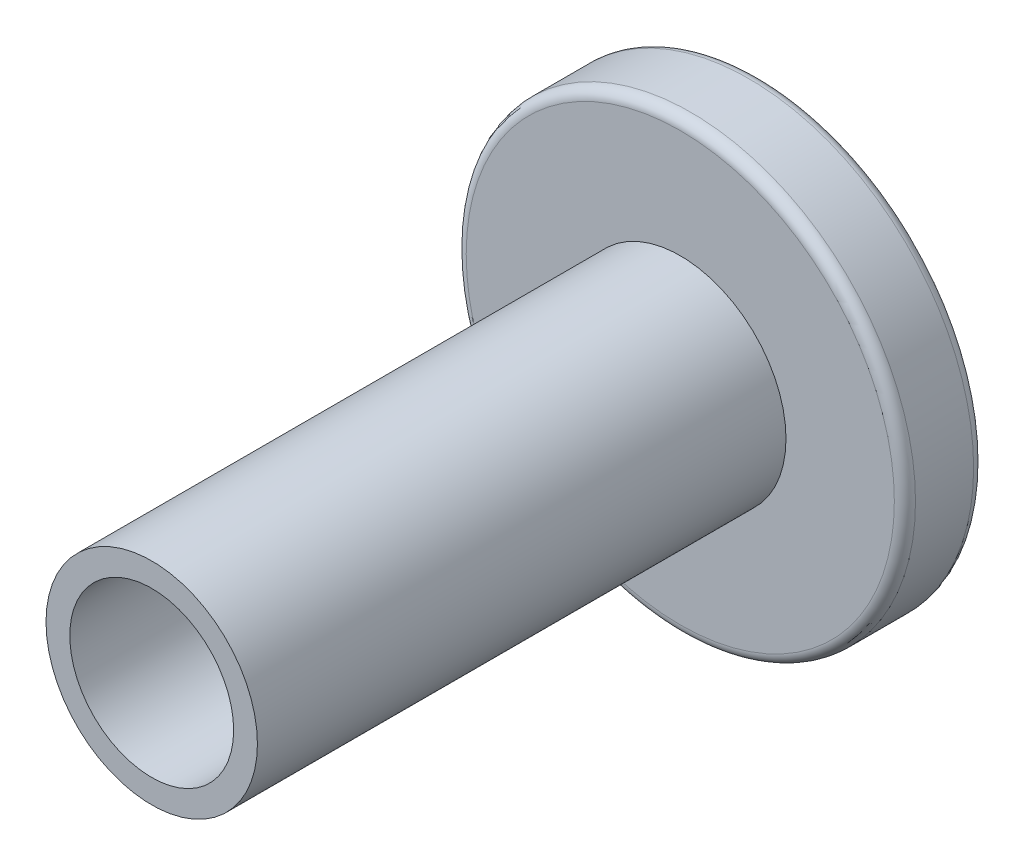
ISO-10303-21;
HEADER;
FILE_DESCRIPTION(('STEP AP214'),'2;1');
FILE_NAME('part.step','',(''),(''),'','','');
FILE_SCHEMA(('AUTOMOTIVE_DESIGN { 1 0 10303 214 1 1 1 1 }'));
ENDSEC;
DATA;
#1=APPLICATION_CONTEXT('core data for automotive mechanical design processes');
#2=APPLICATION_PROTOCOL_DEFINITION('international standard','automotive_design',2000,#1);
#3=PRODUCT_CONTEXT('',#1,'mechanical');
#4=PRODUCT('Part','Part','',(#3));
#5=PRODUCT_RELATED_PRODUCT_CATEGORY('part','',(#4));
#6=PRODUCT_DEFINITION_FORMATION('','',#4);
#7=PRODUCT_DEFINITION_CONTEXT('part definition',#1,'design');
#8=PRODUCT_DEFINITION('design','',#6,#7);
#9=PRODUCT_DEFINITION_SHAPE('','',#8);
#10=(LENGTH_UNIT() NAMED_UNIT(*) SI_UNIT(.MILLI.,.METRE.));
#11=(NAMED_UNIT(*) PLANE_ANGLE_UNIT() SI_UNIT($,.RADIAN.));
#12=(NAMED_UNIT(*) SI_UNIT($,.STERADIAN.) SOLID_ANGLE_UNIT());
#13=UNCERTAINTY_MEASURE_WITH_UNIT(LENGTH_MEASURE(1.E-05),#10,'distance_accuracy_value','');
#14=(GEOMETRIC_REPRESENTATION_CONTEXT(3) GLOBAL_UNCERTAINTY_ASSIGNED_CONTEXT((#13)) GLOBAL_UNIT_ASSIGNED_CONTEXT((#10,
#11,#12)) REPRESENTATION_CONTEXT('',''));
#15=CARTESIAN_POINT('',(0.,0.,0.));
#16=DIRECTION('',(0.,0.,1.));
#17=DIRECTION('',(1.,0.,0.));
#18=AXIS2_PLACEMENT_3D('',#15,#16,#17);
#19=CARTESIAN_POINT('',(0.,0.,1.5));
#20=DIRECTION('',(0.,0.,1.));
#21=DIRECTION('',(1.,0.,0.));
#22=AXIS2_PLACEMENT_3D('',#19,#20,#21);
#23=PLANE('',#22);
#24=CARTESIAN_POINT('',(0.,0.,1.5));
#25=DIRECTION('',(0.,0.,1.));
#26=DIRECTION('',(1.,0.,0.));
#27=AXIS2_PLACEMENT_3D('',#24,#25,#26);
#28=CIRCLE('',#27,1.55);
#29=CARTESIAN_POINT('',(1.55,0.,1.5));
#30=VERTEX_POINT('',#29);
#31=EDGE_CURVE('E148',#30,#30,#28,.F.);
#32=ORIENTED_EDGE('',*,*,#31,.F.);
#33=EDGE_LOOP('',(#32));
#34=FACE_BOUND('',#33,.T.);
#35=DIRECTION('',(-1.,0.,0.));
#36=VECTOR('',#35,1.);
#37=CARTESIAN_POINT('',(0.721687836487032,-1.25,1.5));
#38=LINE('',#37,#36);
#39=CARTESIAN_POINT('',(0.721687836487032,-1.25,1.5));
#40=VERTEX_POINT('',#39);
#41=CARTESIAN_POINT('',(-0.721687836487033,-1.25,1.5));
#42=VERTEX_POINT('',#41);
#43=EDGE_CURVE('E99',#40,#42,#38,.T.);
#44=ORIENTED_EDGE('',*,*,#43,.T.);
#45=DIRECTION('',(-0.5,0.866025403784438,0.));
#46=VECTOR('',#45,1.);
#47=CARTESIAN_POINT('',(-0.721687836487033,-1.25,1.5));
#48=LINE('',#47,#46);
#49=CARTESIAN_POINT('',(-1.44337567297407,0.,1.5));
#50=VERTEX_POINT('',#49);
#51=EDGE_CURVE('E93',#42,#50,#48,.T.);
#52=ORIENTED_EDGE('',*,*,#51,.T.);
#53=DIRECTION('',(0.5,0.866025403784438,0.));
#54=VECTOR('',#53,1.);
#55=CARTESIAN_POINT('',(-1.44337567297407,0.,1.5));
#56=LINE('',#55,#54);
#57=CARTESIAN_POINT('',(-0.721687836487032,1.25,1.5));
#58=VERTEX_POINT('',#57);
#59=EDGE_CURVE('E102',#50,#58,#56,.T.);
#60=ORIENTED_EDGE('',*,*,#59,.T.);
#61=DIRECTION('',(1.,0.,0.));
#62=VECTOR('',#61,1.);
#63=CARTESIAN_POINT('',(-0.721687836487032,1.25,1.5));
#64=LINE('',#63,#62);
#65=CARTESIAN_POINT('',(0.721687836487032,1.25,1.5));
#66=VERTEX_POINT('',#65);
#67=EDGE_CURVE('E53',#58,#66,#64,.T.);
#68=ORIENTED_EDGE('',*,*,#67,.T.);
#69=DIRECTION('',(0.5,-0.866025403784438,0.));
#70=VECTOR('',#69,1.);
#71=CARTESIAN_POINT('',(0.721687836487032,1.25,1.5));
#72=LINE('',#71,#70);
#73=CARTESIAN_POINT('',(1.44337567297406,0.,1.5));
#74=VERTEX_POINT('',#73);
#75=EDGE_CURVE('E115',#66,#74,#72,.T.);
#76=ORIENTED_EDGE('',*,*,#75,.T.);
#77=DIRECTION('',(-0.5,-0.866025403784438,0.));
#78=VECTOR('',#77,1.);
#79=CARTESIAN_POINT('',(1.44337567297406,0.,1.5));
#80=LINE('',#79,#78);
#81=EDGE_CURVE('E118',#74,#40,#80,.T.);
#82=ORIENTED_EDGE('',*,*,#81,.T.);
#83=EDGE_LOOP('',(#44,#52,#60,#68,#76,#82));
#84=FACE_BOUND('',#83,.T.);
#85=ADVANCED_FACE('F38',(#34,#84),#23,.T.);
#86=CARTESIAN_POINT('',(0.,0.,1.5));
#87=DIRECTION('',(0.,0.,-1.));
#88=DIRECTION('',(-1.,0.,0.));
#89=AXIS2_PLACEMENT_3D('',#86,#87,#88);
#90=CYLINDRICAL_SURFACE('',#89,4.25);
#91=CARTESIAN_POINT('',(0.,0.,0.2));
#92=DIRECTION('',(0.,0.,1.));
#93=DIRECTION('',(1.,0.,0.));
#94=AXIS2_PLACEMENT_3D('',#91,#92,#93);
#95=CIRCLE('',#94,4.25);
#96=CARTESIAN_POINT('',(4.25,0.,0.2));
#97=VERTEX_POINT('',#96);
#98=EDGE_CURVE('E156',#97,#97,#95,.T.);
#99=ORIENTED_EDGE('',*,*,#98,.T.);
#100=EDGE_LOOP('',(#99));
#101=FACE_BOUND('',#100,.T.);
#102=CARTESIAN_POINT('',(0.,0.,1.3));
#103=DIRECTION('',(0.,0.,1.));
#104=DIRECTION('',(1.,0.,0.));
#105=AXIS2_PLACEMENT_3D('',#102,#103,#104);
#106=CIRCLE('',#105,4.25);
#107=CARTESIAN_POINT('',(4.25,0.,1.3));
#108=VERTEX_POINT('',#107);
#109=EDGE_CURVE('E153',#108,#108,#106,.F.);
#110=ORIENTED_EDGE('',*,*,#109,.T.);
#111=EDGE_LOOP('',(#110));
#112=FACE_BOUND('',#111,.T.);
#113=ADVANCED_FACE('F169',(#101,#112),#90,.T.);
#114=CARTESIAN_POINT('',(0.,0.,1.5));
#115=DIRECTION('',(0.,0.,1.));
#116=DIRECTION('',(1.,0.,0.));
#117=AXIS2_PLACEMENT_3D('',#114,#115,#116);
#118=CIRCLE('',#117,4.05);
#119=CARTESIAN_POINT('',(4.05,0.,1.5));
#120=VERTEX_POINT('',#119);
#121=EDGE_CURVE('E11',#120,#120,#118,.T.);
#122=ORIENTED_EDGE('',*,*,#121,.T.);
#123=EDGE_LOOP('',(#122));
#124=FACE_BOUND('',#123,.T.);
#125=CARTESIAN_POINT('',(0.,0.,1.5));
#126=DIRECTION('',(0.,0.,1.));
#127=DIRECTION('',(1.,0.,0.));
#128=AXIS2_PLACEMENT_3D('',#125,#126,#127);
#129=CIRCLE('',#128,2.);
#130=CARTESIAN_POINT('',(2.,0.,1.5));
#131=VERTEX_POINT('',#130);
#132=EDGE_CURVE('E144',#131,#131,#129,.T.);
#133=ORIENTED_EDGE('',*,*,#132,.F.);
#134=EDGE_LOOP('',(#133));
#135=FACE_BOUND('',#134,.T.);
#136=ADVANCED_FACE('F172',(#124,#135),#23,.T.);
#137=CARTESIAN_POINT('',(0.,0.,0.));
#138=DIRECTION('',(0.,0.,1.));
#139=DIRECTION('',(1.,0.,0.));
#140=AXIS2_PLACEMENT_3D('',#137,#138,#139);
#141=PLANE('',#140);
#142=DIRECTION('',(0.5,0.866025403784438,0.));
#143=VECTOR('',#142,1.);
#144=CARTESIAN_POINT('',(-1.44337567297407,0.,0.));
#145=LINE('',#144,#143);
#146=CARTESIAN_POINT('',(-1.44337567297407,0.,0.));
#147=VERTEX_POINT('',#146);
#148=CARTESIAN_POINT('',(-0.721687836487032,1.25,0.));
#149=VERTEX_POINT('',#148);
#150=EDGE_CURVE('E122',#147,#149,#145,.T.);
#151=ORIENTED_EDGE('',*,*,#150,.F.);
#152=DIRECTION('',(-0.5,0.866025403784438,0.));
#153=VECTOR('',#152,1.);
#154=CARTESIAN_POINT('',(-0.721687836487033,-1.25,0.));
#155=LINE('',#154,#153);
#156=CARTESIAN_POINT('',(-0.721687836487033,-1.25,0.));
#157=VERTEX_POINT('',#156);
#158=EDGE_CURVE('E61',#157,#147,#155,.T.);
#159=ORIENTED_EDGE('',*,*,#158,.F.);
#160=DIRECTION('',(-1.,0.,0.));
#161=VECTOR('',#160,1.);
#162=CARTESIAN_POINT('',(0.721687836487032,-1.25,0.));
#163=LINE('',#162,#161);
#164=CARTESIAN_POINT('',(0.721687836487032,-1.25,0.));
#165=VERTEX_POINT('',#164);
#166=EDGE_CURVE('E108',#165,#157,#163,.T.);
#167=ORIENTED_EDGE('',*,*,#166,.F.);
#168=DIRECTION('',(-0.5,-0.866025403784438,0.));
#169=VECTOR('',#168,1.);
#170=CARTESIAN_POINT('',(1.44337567297406,0.,0.));
#171=LINE('',#170,#169);
#172=CARTESIAN_POINT('',(1.44337567297406,0.,0.));
#173=VERTEX_POINT('',#172);
#174=EDGE_CURVE('E111',#173,#165,#171,.T.);
#175=ORIENTED_EDGE('',*,*,#174,.F.);
#176=DIRECTION('',(0.5,-0.866025403784438,0.));
#177=VECTOR('',#176,1.);
#178=CARTESIAN_POINT('',(0.721687836487032,1.25,0.));
#179=LINE('',#178,#177);
#180=CARTESIAN_POINT('',(0.721687836487032,1.25,0.));
#181=VERTEX_POINT('',#180);
#182=EDGE_CURVE('E127',#181,#173,#179,.T.);
#183=ORIENTED_EDGE('',*,*,#182,.F.);
#184=DIRECTION('',(1.,0.,0.));
#185=VECTOR('',#184,1.);
#186=CARTESIAN_POINT('',(-0.721687836487032,1.25,0.));
#187=LINE('',#186,#185);
#188=EDGE_CURVE('E124',#149,#181,#187,.T.);
#189=ORIENTED_EDGE('',*,*,#188,.F.);
#190=EDGE_LOOP('',(#151,#159,#167,#175,#183,#189));
#191=FACE_BOUND('',#190,.T.);
#192=CARTESIAN_POINT('',(0.,0.,0.));
#193=DIRECTION('',(0.,0.,1.));
#194=DIRECTION('',(1.,0.,0.));
#195=AXIS2_PLACEMENT_3D('',#192,#193,#194);
#196=CIRCLE('',#195,4.05);
#197=CARTESIAN_POINT('',(4.05,0.,0.));
#198=VERTEX_POINT('',#197);
#199=EDGE_CURVE('E46',#198,#198,#196,.F.);
#200=ORIENTED_EDGE('',*,*,#199,.T.);
#201=EDGE_LOOP('',(#200));
#202=FACE_BOUND('',#201,.T.);
#203=ADVANCED_FACE('F161',(#191,#202),#141,.F.);
#204=CARTESIAN_POINT('',(0.,0.,11.5));
#205=DIRECTION('',(0.,0.,1.));
#206=DIRECTION('',(1.,0.,0.));
#207=AXIS2_PLACEMENT_3D('',#204,#205,#206);
#208=PLANE('',#207);
#209=CARTESIAN_POINT('',(0.,0.,11.5));
#210=DIRECTION('',(0.,0.,1.));
#211=DIRECTION('',(1.,0.,0.));
#212=AXIS2_PLACEMENT_3D('',#209,#210,#211);
#213=CIRCLE('',#212,2.);
#214=CARTESIAN_POINT('',(2.,0.,11.5));
#215=VERTEX_POINT('',#214);
#216=EDGE_CURVE('E145',#215,#215,#213,.T.);
#217=ORIENTED_EDGE('',*,*,#216,.T.);
#218=EDGE_LOOP('',(#217));
#219=FACE_BOUND('',#218,.T.);
#220=CARTESIAN_POINT('',(0.,0.,11.5));
#221=DIRECTION('',(0.,0.,1.));
#222=DIRECTION('',(1.,0.,0.));
#223=AXIS2_PLACEMENT_3D('',#220,#221,#222);
#224=CIRCLE('',#223,1.55);
#225=CARTESIAN_POINT('',(1.55,0.,11.5));
#226=VERTEX_POINT('',#225);
#227=EDGE_CURVE('E134',#226,#226,#224,.T.);
#228=ORIENTED_EDGE('',*,*,#227,.F.);
#229=EDGE_LOOP('',(#228));
#230=FACE_BOUND('',#229,.T.);
#231=ADVANCED_FACE('F187',(#219,#230),#208,.T.);
#232=CARTESIAN_POINT('',(0.,0.,11.5));
#233=DIRECTION('',(0.,0.,-1.));
#234=DIRECTION('',(-1.,0.,0.));
#235=AXIS2_PLACEMENT_3D('',#232,#233,#234);
#236=CYLINDRICAL_SURFACE('',#235,2.);
#237=ORIENTED_EDGE('',*,*,#216,.F.);
#238=EDGE_LOOP('',(#237));
#239=FACE_BOUND('',#238,.T.);
#240=ORIENTED_EDGE('',*,*,#132,.T.);
#241=EDGE_LOOP('',(#240));
#242=FACE_BOUND('',#241,.T.);
#243=ADVANCED_FACE('F185',(#239,#242),#236,.T.);
#244=CARTESIAN_POINT('',(0.,0.,11.5));
#245=DIRECTION('',(0.,0.,-1.));
#246=DIRECTION('',(-1.,0.,0.));
#247=AXIS2_PLACEMENT_3D('',#244,#245,#246);
#248=CYLINDRICAL_SURFACE('',#247,1.55);
#249=ORIENTED_EDGE('',*,*,#227,.T.);
#250=EDGE_LOOP('',(#249));
#251=FACE_BOUND('',#250,.T.);
#252=ORIENTED_EDGE('',*,*,#31,.T.);
#253=EDGE_LOOP('',(#252));
#254=FACE_BOUND('',#253,.T.);
#255=ADVANCED_FACE('F166',(#251,#254),#248,.F.);
#256=CARTESIAN_POINT('',(0.,0.,0.2));
#257=DIRECTION('',(0.,0.,1.));
#258=DIRECTION('',(1.,0.,0.));
#259=AXIS2_PLACEMENT_3D('',#256,#257,#258);
#260=TOROIDAL_SURFACE('',#259,4.05,0.2);
#261=ORIENTED_EDGE('',*,*,#199,.F.);
#262=EDGE_LOOP('',(#261));
#263=FACE_BOUND('',#262,.T.);
#264=ORIENTED_EDGE('',*,*,#98,.F.);
#265=EDGE_LOOP('',(#264));
#266=FACE_BOUND('',#265,.T.);
#267=ADVANCED_FACE('F163',(#263,#266),#260,.T.);
#268=CARTESIAN_POINT('',(0.,0.,1.3));
#269=DIRECTION('',(0.,0.,1.));
#270=DIRECTION('',(1.,0.,0.));
#271=AXIS2_PLACEMENT_3D('',#268,#269,#270);
#272=TOROIDAL_SURFACE('',#271,4.05,0.2);
#273=ORIENTED_EDGE('',*,*,#109,.F.);
#274=EDGE_LOOP('',(#273));
#275=FACE_BOUND('',#274,.T.);
#276=ORIENTED_EDGE('',*,*,#121,.F.);
#277=EDGE_LOOP('',(#276));
#278=FACE_BOUND('',#277,.T.);
#279=ADVANCED_FACE('F40',(#275,#278),#272,.T.);
#280=CARTESIAN_POINT('',(-0.721687836487033,-1.25,1.5));
#281=DIRECTION('',(-0.866025403784439,-0.5,0.));
#282=DIRECTION('',(0.5,-0.866025403784439,0.));
#283=AXIS2_PLACEMENT_3D('',#280,#281,#282);
#284=PLANE('',#283);
#285=ORIENTED_EDGE('',*,*,#158,.T.);
#286=DIRECTION('',(0.,0.,-1.));
#287=VECTOR('',#286,1.);
#288=CARTESIAN_POINT('',(-1.44337567297407,0.,1.5));
#289=LINE('',#288,#287);
#290=EDGE_CURVE('E89',#50,#147,#289,.T.);
#291=ORIENTED_EDGE('',*,*,#290,.F.);
#292=ORIENTED_EDGE('',*,*,#51,.F.);
#293=DIRECTION('',(0.,0.,-1.));
#294=VECTOR('',#293,1.);
#295=CARTESIAN_POINT('',(-0.721687836487033,-1.25,1.5));
#296=LINE('',#295,#294);
#297=EDGE_CURVE('E132',#42,#157,#296,.T.);
#298=ORIENTED_EDGE('',*,*,#297,.T.);
#299=EDGE_LOOP('',(#285,#291,#292,#298));
#300=FACE_BOUND('',#299,.T.);
#301=ADVANCED_FACE('F91',(#300),#284,.F.);
#302=CARTESIAN_POINT('',(0.721687836487032,-1.25,1.5));
#303=DIRECTION('',(0.,-1.,0.));
#304=DIRECTION('',(1.,0.,0.));
#305=AXIS2_PLACEMENT_3D('',#302,#303,#304);
#306=PLANE('',#305);
#307=ORIENTED_EDGE('',*,*,#166,.T.);
#308=ORIENTED_EDGE('',*,*,#297,.F.);
#309=ORIENTED_EDGE('',*,*,#43,.F.);
#310=DIRECTION('',(0.,0.,-1.));
#311=VECTOR('',#310,1.);
#312=CARTESIAN_POINT('',(0.721687836487032,-1.25,1.5));
#313=LINE('',#312,#311);
#314=EDGE_CURVE('E135',#40,#165,#313,.T.);
#315=ORIENTED_EDGE('',*,*,#314,.T.);
#316=EDGE_LOOP('',(#307,#308,#309,#315));
#317=FACE_BOUND('',#316,.T.);
#318=ADVANCED_FACE('F221',(#317),#306,.F.);
#319=CARTESIAN_POINT('',(1.44337567297406,0.,1.5));
#320=DIRECTION('',(0.866025403784439,-0.5,0.));
#321=DIRECTION('',(0.5,0.866025403784439,0.));
#322=AXIS2_PLACEMENT_3D('',#319,#320,#321);
#323=PLANE('',#322);
#324=ORIENTED_EDGE('',*,*,#174,.T.);
#325=ORIENTED_EDGE('',*,*,#314,.F.);
#326=ORIENTED_EDGE('',*,*,#81,.F.);
#327=DIRECTION('',(0.,0.,-1.));
#328=VECTOR('',#327,1.);
#329=CARTESIAN_POINT('',(1.44337567297406,0.,1.5));
#330=LINE('',#329,#328);
#331=EDGE_CURVE('E137',#74,#173,#330,.T.);
#332=ORIENTED_EDGE('',*,*,#331,.T.);
#333=EDGE_LOOP('',(#324,#325,#326,#332));
#334=FACE_BOUND('',#333,.T.);
#335=ADVANCED_FACE('F219',(#334),#323,.F.);
#336=CARTESIAN_POINT('',(0.721687836487032,1.25,1.5));
#337=DIRECTION('',(0.866025403784439,0.5,0.));
#338=DIRECTION('',(-0.5,0.866025403784439,0.));
#339=AXIS2_PLACEMENT_3D('',#336,#337,#338);
#340=PLANE('',#339);
#341=ORIENTED_EDGE('',*,*,#182,.T.);
#342=ORIENTED_EDGE('',*,*,#331,.F.);
#343=ORIENTED_EDGE('',*,*,#75,.F.);
#344=DIRECTION('',(0.,0.,-1.));
#345=VECTOR('',#344,1.);
#346=CARTESIAN_POINT('',(0.721687836487032,1.25,1.5));
#347=LINE('',#346,#345);
#348=EDGE_CURVE('E139',#66,#181,#347,.T.);
#349=ORIENTED_EDGE('',*,*,#348,.T.);
#350=EDGE_LOOP('',(#341,#342,#343,#349));
#351=FACE_BOUND('',#350,.T.);
#352=ADVANCED_FACE('F216',(#351),#340,.F.);
#353=CARTESIAN_POINT('',(-0.721687836487032,1.25,1.5));
#354=DIRECTION('',(0.,1.,0.));
#355=DIRECTION('',(0.,0.,1.));
#356=AXIS2_PLACEMENT_3D('',#353,#354,#355);
#357=PLANE('',#356);
#358=ORIENTED_EDGE('',*,*,#188,.T.);
#359=ORIENTED_EDGE('',*,*,#348,.F.);
#360=ORIENTED_EDGE('',*,*,#67,.F.);
#361=DIRECTION('',(0.,0.,-1.));
#362=VECTOR('',#361,1.);
#363=CARTESIAN_POINT('',(-0.721687836487032,1.25,1.5));
#364=LINE('',#363,#362);
#365=EDGE_CURVE('E98',#58,#149,#364,.T.);
#366=ORIENTED_EDGE('',*,*,#365,.T.);
#367=EDGE_LOOP('',(#358,#359,#360,#366));
#368=FACE_BOUND('',#367,.T.);
#369=ADVANCED_FACE('F213',(#368),#357,.F.);
#370=CARTESIAN_POINT('',(-1.44337567297407,0.,1.5));
#371=DIRECTION('',(-0.866025403784438,0.5,0.));
#372=DIRECTION('',(-0.5,-0.866025403784438,0.));
#373=AXIS2_PLACEMENT_3D('',#370,#371,#372);
#374=PLANE('',#373);
#375=ORIENTED_EDGE('',*,*,#150,.T.);
#376=ORIENTED_EDGE('',*,*,#365,.F.);
#377=ORIENTED_EDGE('',*,*,#59,.F.);
#378=ORIENTED_EDGE('',*,*,#290,.T.);
#379=EDGE_LOOP('',(#375,#376,#377,#378));
#380=FACE_BOUND('',#379,.T.);
#381=ADVANCED_FACE('F103',(#380),#374,.F.);
#382=CLOSED_SHELL('',(#85,#113,#136,#203,#231,#243,#255,#267,#279,#301,#318,#335,#352,#369,#381));
#383=MANIFOLD_SOLID_BREP('B2',#382);
#384=ADVANCED_BREP_SHAPE_REPRESENTATION('',(#18,#383),#14);
#385=SHAPE_DEFINITION_REPRESENTATION(#9,#384);
ENDSEC;
END-ISO-10303-21;
